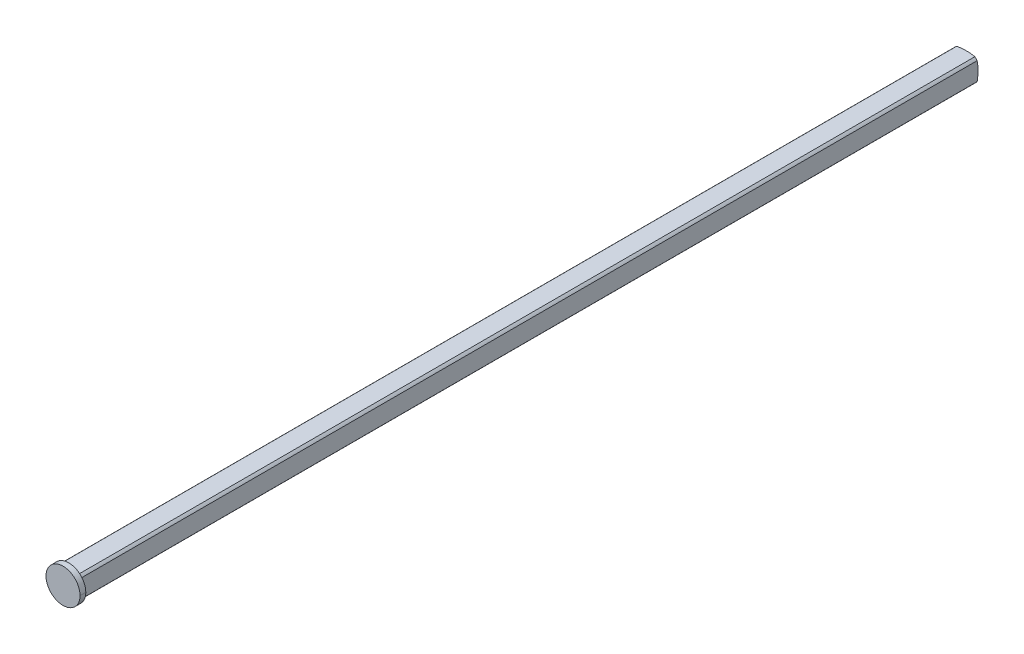
ISO-10303-21;
HEADER;
FILE_DESCRIPTION(('STEP AP214'),'2;1');
FILE_NAME('part.step','',(''),(''),'','','');
FILE_SCHEMA(('AUTOMOTIVE_DESIGN { 1 0 10303 214 1 1 1 1 }'));
ENDSEC;
DATA;
#1=APPLICATION_CONTEXT('core data for automotive mechanical design processes');
#2=APPLICATION_PROTOCOL_DEFINITION('international standard','automotive_design',2000,#1);
#3=PRODUCT_CONTEXT('',#1,'mechanical');
#4=PRODUCT('Part','Part','',(#3));
#5=PRODUCT_RELATED_PRODUCT_CATEGORY('part','',(#4));
#6=PRODUCT_DEFINITION_FORMATION('','',#4);
#7=PRODUCT_DEFINITION_CONTEXT('part definition',#1,'design');
#8=PRODUCT_DEFINITION('design','',#6,#7);
#9=PRODUCT_DEFINITION_SHAPE('','',#8);
#10=(LENGTH_UNIT() NAMED_UNIT(*) SI_UNIT(.MILLI.,.METRE.));
#11=(NAMED_UNIT(*) PLANE_ANGLE_UNIT() SI_UNIT($,.RADIAN.));
#12=(NAMED_UNIT(*) SI_UNIT($,.STERADIAN.) SOLID_ANGLE_UNIT());
#13=UNCERTAINTY_MEASURE_WITH_UNIT(LENGTH_MEASURE(1.E-05),#10,'distance_accuracy_value','');
#14=(GEOMETRIC_REPRESENTATION_CONTEXT(3) GLOBAL_UNCERTAINTY_ASSIGNED_CONTEXT((#13)) GLOBAL_UNIT_ASSIGNED_CONTEXT((#10,
#11,#12)) REPRESENTATION_CONTEXT('',''));
#15=CARTESIAN_POINT('',(0.,0.,0.));
#16=DIRECTION('',(0.,0.,1.));
#17=DIRECTION('',(1.,0.,0.));
#18=AXIS2_PLACEMENT_3D('',#15,#16,#17);
#19=CARTESIAN_POINT('',(0.,0.,0.));
#20=DIRECTION('',(0.,0.,1.));
#21=DIRECTION('',(1.,0.,0.));
#22=AXIS2_PLACEMENT_3D('',#19,#20,#21);
#23=PLANE('',#22);
#24=CARTESIAN_POINT('',(0.,0.,0.));
#25=DIRECTION('',(0.,0.,1.));
#26=DIRECTION('',(1.,0.,0.));
#27=AXIS2_PLACEMENT_3D('',#24,#25,#26);
#28=CIRCLE('',#27,2.375);
#29=CARTESIAN_POINT('',(-2.375,0.,0.));
#30=VERTEX_POINT('',#29);
#31=CARTESIAN_POINT('',(2.375,0.,0.));
#32=VERTEX_POINT('',#31);
#33=EDGE_CURVE('P0_E11',#30,#32,#28,.T.);
#34=ORIENTED_EDGE('',*,*,#33,.F.);
#35=CARTESIAN_POINT('',(0.,0.,0.));
#36=DIRECTION('',(0.,0.,1.));
#37=DIRECTION('',(1.,0.,0.));
#38=AXIS2_PLACEMENT_3D('',#35,#36,#37);
#39=CIRCLE('',#38,2.375);
#40=EDGE_CURVE('P0_E68',#32,#30,#39,.T.);
#41=ORIENTED_EDGE('',*,*,#40,.F.);
#42=EDGE_LOOP('',(#34,#41));
#43=FACE_BOUND('',#42,.T.);
#44=ADVANCED_FACE('P0_F17',(#43),#23,.F.);
#45=CARTESIAN_POINT('',(0.,0.,0.8));
#46=DIRECTION('',(0.,0.,1.));
#47=DIRECTION('',(1.,0.,0.));
#48=AXIS2_PLACEMENT_3D('',#45,#46,#47);
#49=PLANE('',#48);
#50=CARTESIAN_POINT('',(0.,0.,0.8));
#51=DIRECTION('',(0.,0.,1.));
#52=DIRECTION('',(1.,0.,0.));
#53=AXIS2_PLACEMENT_3D('',#50,#51,#52);
#54=CIRCLE('',#53,2.375);
#55=CARTESIAN_POINT('',(-2.375,0.,0.8));
#56=VERTEX_POINT('',#55);
#57=CARTESIAN_POINT('',(2.375,0.,0.8));
#58=VERTEX_POINT('',#57);
#59=EDGE_CURVE('P0_E27',#56,#58,#54,.T.);
#60=ORIENTED_EDGE('',*,*,#59,.T.);
#61=CARTESIAN_POINT('',(0.,0.,0.8));
#62=DIRECTION('',(0.,0.,1.));
#63=DIRECTION('',(1.,0.,0.));
#64=AXIS2_PLACEMENT_3D('',#61,#62,#63);
#65=CIRCLE('',#64,2.375);
#66=EDGE_CURVE('P0_E59',#58,#56,#65,.T.);
#67=ORIENTED_EDGE('',*,*,#66,.T.);
#68=EDGE_LOOP('',(#60,#67));
#69=FACE_BOUND('',#68,.T.);
#70=ADVANCED_FACE('P0_F57',(#69),#49,.T.);
#71=CARTESIAN_POINT('',(0.,0.,0.8));
#72=DIRECTION('',(0.,0.,-1.));
#73=DIRECTION('',(-1.,0.,0.));
#74=AXIS2_PLACEMENT_3D('',#71,#72,#73);
#75=CYLINDRICAL_SURFACE('',#74,2.375);
#76=DIRECTION('',(0.,0.,-1.));
#77=VECTOR('',#76,1.);
#78=CARTESIAN_POINT('',(2.375,0.,0.8));
#79=LINE('',#78,#77);
#80=EDGE_CURVE('P0_E63',#58,#32,#79,.T.);
#81=ORIENTED_EDGE('',*,*,#80,.F.);
#82=ORIENTED_EDGE('',*,*,#59,.F.);
#83=DIRECTION('',(0.,0.,-1.));
#84=VECTOR('',#83,1.);
#85=CARTESIAN_POINT('',(-2.375,0.,0.8));
#86=LINE('',#85,#84);
#87=EDGE_CURVE('P0_E21',#56,#30,#86,.T.);
#88=ORIENTED_EDGE('',*,*,#87,.T.);
#89=ORIENTED_EDGE('',*,*,#33,.T.);
#90=EDGE_LOOP('',(#81,#82,#88,#89));
#91=FACE_BOUND('',#90,.T.);
#92=ADVANCED_FACE('P0_F64',(#91),#75,.T.);
#93=CARTESIAN_POINT('',(0.,0.,0.8));
#94=DIRECTION('',(0.,0.,-1.));
#95=DIRECTION('',(-1.,0.,0.));
#96=AXIS2_PLACEMENT_3D('',#93,#94,#95);
#97=CYLINDRICAL_SURFACE('',#96,2.375);
#98=ORIENTED_EDGE('',*,*,#66,.F.);
#99=ORIENTED_EDGE('',*,*,#80,.T.);
#100=ORIENTED_EDGE('',*,*,#40,.T.);
#101=ORIENTED_EDGE('',*,*,#87,.F.);
#102=EDGE_LOOP('',(#98,#99,#100,#101));
#103=FACE_BOUND('',#102,.T.);
#104=ADVANCED_FACE('P0_F19',(#103),#97,.T.);
#105=CLOSED_SHELL('',(#44,#70,#92,#104));
#106=MANIFOLD_SOLID_BREP('P0_B1',#105);
#107=CARTESIAN_POINT('',(0.,0.,-125.222));
#108=DIRECTION('',(0.,0.,1.));
#109=DIRECTION('',(1.,0.,0.));
#110=AXIS2_PLACEMENT_3D('',#107,#108,#109);
#111=CYLINDRICAL_SURFACE('',#110,2.032);
#112=DIRECTION('',(0.,0.,-1.));
#113=VECTOR('',#112,1.);
#114=CARTESIAN_POINT('',(1.5875,1.26841150657032,-125.222));
#115=LINE('',#114,#113);
#116=CARTESIAN_POINT('',(1.5875,1.26841150657032,0.));
#117=VERTEX_POINT('',#116);
#118=CARTESIAN_POINT('',(1.5875,1.26841150657032,-125.070919142098));
#119=VERTEX_POINT('',#118);
#120=EDGE_CURVE('P1_E464',#117,#119,#115,.T.);
#121=ORIENTED_EDGE('',*,*,#120,.T.);
#122=CARTESIAN_POINT('',(0.,0.,-125.070919142098));
#123=DIRECTION('',(0.,0.,1.));
#124=DIRECTION('',(1.,0.,0.));
#125=AXIS2_PLACEMENT_3D('',#122,#123,#124);
#126=CIRCLE('',#125,2.032);
#127=CARTESIAN_POINT('',(1.26841150657032,1.5875,-125.070919142098));
#128=VERTEX_POINT('',#127);
#129=EDGE_CURVE('P1_E266',#119,#128,#126,.T.);
#130=ORIENTED_EDGE('',*,*,#129,.T.);
#131=DIRECTION('',(0.,0.,1.));
#132=VECTOR('',#131,1.);
#133=CARTESIAN_POINT('',(1.26841150657032,1.5875,-125.222));
#134=LINE('',#133,#132);
#135=CARTESIAN_POINT('',(1.26841150657032,1.5875,0.));
#136=VERTEX_POINT('',#135);
#137=EDGE_CURVE('P1_E238',#128,#136,#134,.T.);
#138=ORIENTED_EDGE('',*,*,#137,.T.);
#139=CARTESIAN_POINT('',(0.,0.,0.));
#140=DIRECTION('',(0.,0.,1.));
#141=DIRECTION('',(1.,0.,0.));
#142=AXIS2_PLACEMENT_3D('',#139,#140,#141);
#143=CIRCLE('',#142,2.032);
#144=EDGE_CURVE('P1_E138',#117,#136,#143,.T.);
#145=ORIENTED_EDGE('',*,*,#144,.F.);
#146=EDGE_LOOP('',(#121,#130,#138,#145));
#147=FACE_BOUND('',#146,.T.);
#148=ADVANCED_FACE('P1_F17',(#147),#111,.T.);
#149=CARTESIAN_POINT('',(0.,0.,-125.222));
#150=DIRECTION('',(0.,0.,1.));
#151=DIRECTION('',(1.,0.,0.));
#152=AXIS2_PLACEMENT_3D('',#149,#150,#151);
#153=CYLINDRICAL_SURFACE('',#152,2.032);
#154=DIRECTION('',(0.,0.,1.));
#155=VECTOR('',#154,1.);
#156=CARTESIAN_POINT('',(-1.5875,1.26841150657032,-125.222));
#157=LINE('',#156,#155);
#158=CARTESIAN_POINT('',(-1.5875,1.26841150657032,-125.070919142098));
#159=VERTEX_POINT('',#158);
#160=CARTESIAN_POINT('',(-1.5875,1.26841150657032,0.));
#161=VERTEX_POINT('',#160);
#162=EDGE_CURVE('P1_E213',#159,#161,#157,.T.);
#163=ORIENTED_EDGE('',*,*,#162,.T.);
#164=CARTESIAN_POINT('',(0.,0.,0.));
#165=DIRECTION('',(0.,0.,1.));
#166=DIRECTION('',(1.,0.,0.));
#167=AXIS2_PLACEMENT_3D('',#164,#165,#166);
#168=CIRCLE('',#167,2.032);
#169=CARTESIAN_POINT('',(-1.26841150657032,1.5875,0.));
#170=VERTEX_POINT('',#169);
#171=EDGE_CURVE('P1_E44',#170,#161,#168,.T.);
#172=ORIENTED_EDGE('',*,*,#171,.F.);
#173=DIRECTION('',(0.,0.,-1.));
#174=VECTOR('',#173,1.);
#175=CARTESIAN_POINT('',(-1.26841150657032,1.5875,-125.222));
#176=LINE('',#175,#174);
#177=CARTESIAN_POINT('',(-1.26841150657032,1.5875,-125.070919142098));
#178=VERTEX_POINT('',#177);
#179=EDGE_CURVE('P1_E246',#170,#178,#176,.T.);
#180=ORIENTED_EDGE('',*,*,#179,.T.);
#181=CARTESIAN_POINT('',(0.,0.,-125.070919142098));
#182=DIRECTION('',(0.,0.,1.));
#183=DIRECTION('',(1.,0.,0.));
#184=AXIS2_PLACEMENT_3D('',#181,#182,#183);
#185=CIRCLE('',#184,2.032);
#186=EDGE_CURVE('P1_E255',#178,#159,#185,.T.);
#187=ORIENTED_EDGE('',*,*,#186,.T.);
#188=EDGE_LOOP('',(#163,#172,#180,#187));
#189=FACE_BOUND('',#188,.T.);
#190=ADVANCED_FACE('P1_F361',(#189),#153,.T.);
#191=CARTESIAN_POINT('',(0.,0.,-125.222));
#192=DIRECTION('',(0.,0.,1.));
#193=DIRECTION('',(1.,0.,0.));
#194=AXIS2_PLACEMENT_3D('',#191,#192,#193);
#195=CYLINDRICAL_SURFACE('',#194,2.032);
#196=DIRECTION('',(0.,0.,-1.));
#197=VECTOR('',#196,1.);
#198=CARTESIAN_POINT('',(-1.5875,-1.26841150657032,-125.222));
#199=LINE('',#198,#197);
#200=CARTESIAN_POINT('',(-1.5875,-1.26841150657032,0.));
#201=VERTEX_POINT('',#200);
#202=CARTESIAN_POINT('',(-1.5875,-1.26841150657032,-125.070919142098));
#203=VERTEX_POINT('',#202);
#204=EDGE_CURVE('P1_E286',#201,#203,#199,.T.);
#205=ORIENTED_EDGE('',*,*,#204,.T.);
#206=CARTESIAN_POINT('',(0.,0.,-125.070919142098));
#207=DIRECTION('',(0.,0.,1.));
#208=DIRECTION('',(1.,0.,0.));
#209=AXIS2_PLACEMENT_3D('',#206,#207,#208);
#210=CIRCLE('',#209,2.032);
#211=CARTESIAN_POINT('',(-1.26841150657032,-1.5875,-125.070919142098));
#212=VERTEX_POINT('',#211);
#213=EDGE_CURVE('P1_E11',#203,#212,#210,.T.);
#214=ORIENTED_EDGE('',*,*,#213,.T.);
#215=DIRECTION('',(0.,0.,1.));
#216=VECTOR('',#215,1.);
#217=CARTESIAN_POINT('',(-1.26841150657032,-1.5875,-125.222));
#218=LINE('',#217,#216);
#219=CARTESIAN_POINT('',(-1.26841150657032,-1.5875,0.));
#220=VERTEX_POINT('',#219);
#221=EDGE_CURVE('P1_E159',#212,#220,#218,.T.);
#222=ORIENTED_EDGE('',*,*,#221,.T.);
#223=CARTESIAN_POINT('',(0.,0.,0.));
#224=DIRECTION('',(0.,0.,1.));
#225=DIRECTION('',(1.,0.,0.));
#226=AXIS2_PLACEMENT_3D('',#223,#224,#225);
#227=CIRCLE('',#226,2.032);
#228=EDGE_CURVE('P1_E139',#201,#220,#227,.T.);
#229=ORIENTED_EDGE('',*,*,#228,.F.);
#230=EDGE_LOOP('',(#205,#214,#222,#229));
#231=FACE_BOUND('',#230,.T.);
#232=ADVANCED_FACE('P1_F223',(#231),#195,.T.);
#233=CARTESIAN_POINT('',(0.,0.,-125.222));
#234=DIRECTION('',(0.,0.,1.));
#235=DIRECTION('',(1.,0.,0.));
#236=AXIS2_PLACEMENT_3D('',#233,#234,#235);
#237=CYLINDRICAL_SURFACE('',#236,2.032);
#238=DIRECTION('',(0.,0.,-1.));
#239=VECTOR('',#238,1.);
#240=CARTESIAN_POINT('',(1.26841150657032,-1.5875,-125.222));
#241=LINE('',#240,#239);
#242=CARTESIAN_POINT('',(1.26841150657032,-1.5875,0.));
#243=VERTEX_POINT('',#242);
#244=CARTESIAN_POINT('',(1.26841150657032,-1.5875,-125.070919142098));
#245=VERTEX_POINT('',#244);
#246=EDGE_CURVE('P1_E131',#243,#245,#241,.T.);
#247=ORIENTED_EDGE('',*,*,#246,.T.);
#248=CARTESIAN_POINT('',(0.,0.,-125.070919142098));
#249=DIRECTION('',(0.,0.,1.));
#250=DIRECTION('',(1.,0.,0.));
#251=AXIS2_PLACEMENT_3D('',#248,#249,#250);
#252=CIRCLE('',#251,2.032);
#253=CARTESIAN_POINT('',(1.5875,-1.26841150657032,-125.070919142098));
#254=VERTEX_POINT('',#253);
#255=EDGE_CURVE('P1_E29',#245,#254,#252,.T.);
#256=ORIENTED_EDGE('',*,*,#255,.T.);
#257=DIRECTION('',(0.,0.,1.));
#258=VECTOR('',#257,1.);
#259=CARTESIAN_POINT('',(1.5875,-1.26841150657032,-125.222));
#260=LINE('',#259,#258);
#261=CARTESIAN_POINT('',(1.5875,-1.26841150657032,0.));
#262=VERTEX_POINT('',#261);
#263=EDGE_CURVE('P1_E134',#254,#262,#260,.T.);
#264=ORIENTED_EDGE('',*,*,#263,.T.);
#265=CARTESIAN_POINT('',(0.,0.,0.));
#266=DIRECTION('',(0.,0.,1.));
#267=DIRECTION('',(1.,0.,0.));
#268=AXIS2_PLACEMENT_3D('',#265,#266,#267);
#269=CIRCLE('',#268,2.032);
#270=EDGE_CURVE('P1_E127',#243,#262,#269,.T.);
#271=ORIENTED_EDGE('',*,*,#270,.F.);
#272=EDGE_LOOP('',(#247,#256,#264,#271));
#273=FACE_BOUND('',#272,.T.);
#274=ADVANCED_FACE('P1_F129',(#273),#237,.T.);
#275=CARTESIAN_POINT('',(-1.5875,1.5875,-125.222));
#276=DIRECTION('',(0.,0.,-1.));
#277=DIRECTION('',(0.,-1.,0.));
#278=AXIS2_PLACEMENT_3D('',#275,#276,#277);
#279=PLANE('',#278);
#280=CARTESIAN_POINT('',(0.,0.,-125.222));
#281=DIRECTION('',(0.,0.,1.));
#282=DIRECTION('',(1.,0.,0.));
#283=AXIS2_PLACEMENT_3D('',#280,#281,#282);
#284=CIRCLE('',#283,1.24506403026729);
#285=CARTESIAN_POINT('',(1.24506403026729,0.,-125.222));
#286=VERTEX_POINT('',#285);
#287=CARTESIAN_POINT('',(-1.24506403026729,0.,-125.222));
#288=VERTEX_POINT('',#287);
#289=EDGE_CURVE('P1_E273',#286,#288,#284,.T.);
#290=ORIENTED_EDGE('',*,*,#289,.F.);
#291=CARTESIAN_POINT('',(0.,0.,-125.222));
#292=DIRECTION('',(0.,0.,1.));
#293=DIRECTION('',(1.,0.,0.));
#294=AXIS2_PLACEMENT_3D('',#291,#292,#293);
#295=CIRCLE('',#294,1.24506403026729);
#296=EDGE_CURVE('P1_E476',#288,#286,#295,.T.);
#297=ORIENTED_EDGE('',*,*,#296,.F.);
#298=EDGE_LOOP('',(#290,#297));
#299=FACE_BOUND('',#298,.T.);
#300=ADVANCED_FACE('P1_F408',(#299),#279,.T.);
#301=CARTESIAN_POINT('',(0.,0.,-123.097));
#302=DIRECTION('',(0.,0.,1.));
#303=DIRECTION('',(1.,0.,0.));
#304=AXIS2_PLACEMENT_3D('',#301,#302,#303);
#305=DEGENERATE_TOROIDAL_SURFACE('',#304,1.24506403026729,2.125,.T.);
#306=CARTESIAN_POINT('',(-1.24506403026729,0.,-123.097));
#307=DIRECTION('',(0.,1.,0.));
#308=DIRECTION('',(-1.,0.,0.));
#309=AXIS2_PLACEMENT_3D('',#306,#307,#308);
#310=CIRCLE('',#309,2.125);
#311=CARTESIAN_POINT('',(-1.5875,0.,-125.194227361693));
#312=VERTEX_POINT('',#311);
#313=EDGE_CURVE('P1_E268',#288,#312,#310,.T.);
#314=ORIENTED_EDGE('',*,*,#313,.F.);
#315=ORIENTED_EDGE('',*,*,#296,.T.);
#316=CARTESIAN_POINT('',(1.24506403026729,0.,-123.097));
#317=DIRECTION('',(0.,-1.,0.));
#318=DIRECTION('',(0.,0.,-1.));
#319=AXIS2_PLACEMENT_3D('',#316,#317,#318);
#320=CIRCLE('',#319,2.125);
#321=CARTESIAN_POINT('',(1.5875,0.,-125.194227361693));
#322=VERTEX_POINT('',#321);
#323=EDGE_CURVE('P1_E308',#286,#322,#320,.T.);
#324=ORIENTED_EDGE('',*,*,#323,.T.);
#325=CARTESIAN_POINT('',(1.5875,-1.26841150657032,-125.070919142098));
#326=CARTESIAN_POINT('',(1.5875,-0.987077094901041,-125.140930639138));
#327=CARTESIAN_POINT('',(1.5875,-0.639530459017566,-125.17018195389));
#328=CARTESIAN_POINT('',(1.5875,-0.353837297484592,-125.194227361693));
#329=CARTESIAN_POINT('',(1.5875,0.,-125.194227361693));
#330=B_SPLINE_CURVE_WITH_KNOTS('',2,(#325,#326,#327,#328,#329),.UNSPECIFIED.,.F.,.F.,(3,2,3),
(0.,0.5,1.),.UNSPECIFIED.);
#331=EDGE_CURVE('P1_E470',#254,#322,#330,.T.);
#332=ORIENTED_EDGE('',*,*,#331,.F.);
#333=ORIENTED_EDGE('',*,*,#255,.F.);
#334=CARTESIAN_POINT('',(-1.26841150657032,-1.5875,-125.070919142098));
#335=CARTESIAN_POINT('',(-0.770338232285675,-1.5875,-125.194867205761));
#336=CARTESIAN_POINT('',(0.00849337593367507,-1.5875,-125.19422365179));
#337=CARTESIAN_POINT('',(0.77547099032373,-1.5875,-125.193589892857));
#338=CARTESIAN_POINT('',(1.26841150657033,-1.5875,-125.070919142098));
#339=B_SPLINE_CURVE_WITH_KNOTS('',2,(#334,#335,#336,#337,#338),.UNSPECIFIED.,.F.,.F.,(3,2,3),
(0.,0.5,1.),.UNSPECIFIED.);
#340=EDGE_CURVE('P1_E150',#212,#245,#339,.T.);
#341=ORIENTED_EDGE('',*,*,#340,.F.);
#342=ORIENTED_EDGE('',*,*,#213,.F.);
#343=CARTESIAN_POINT('',(-1.5875,0.,-125.194227361693));
#344=CARTESIAN_POINT('',(-1.5875,-0.353179957326968,-125.194227361693));
#345=CARTESIAN_POINT('',(-1.5875,-0.639529322286498,-125.170182049451));
#346=CARTESIAN_POINT('',(-1.5875,-0.986669843198274,-125.141031985792));
#347=CARTESIAN_POINT('',(-1.5875,-1.26841150657032,-125.070919142098));
#348=B_SPLINE_CURVE_WITH_KNOTS('',2,(#343,#344,#345,#346,#347),.UNSPECIFIED.,.F.,.F.,(3,2,3),
(0.,0.5,1.),.UNSPECIFIED.);
#349=EDGE_CURVE('P1_E171',#312,#203,#348,.T.);
#350=ORIENTED_EDGE('',*,*,#349,.F.);
#351=EDGE_LOOP('',(#314,#315,#324,#332,#333,#341,#342,#350));
#352=FACE_BOUND('',#351,.T.);
#353=ADVANCED_FACE('P1_F382',(#352),#305,.T.);
#354=CARTESIAN_POINT('',(-1.5875,1.5875,0.));
#355=DIRECTION('',(0.,0.,-1.));
#356=DIRECTION('',(0.,-1.,0.));
#357=AXIS2_PLACEMENT_3D('',#354,#355,#356);
#358=PLANE('',#357);
#359=ORIENTED_EDGE('',*,*,#171,.T.);
#360=DIRECTION('',(0.,-1.,0.));
#361=VECTOR('',#360,1.);
#362=CARTESIAN_POINT('',(-1.5875,-1.5875,0.));
#363=LINE('',#362,#361);
#364=EDGE_CURVE('P1_E289',#161,#201,#363,.T.);
#365=ORIENTED_EDGE('',*,*,#364,.T.);
#366=ORIENTED_EDGE('',*,*,#228,.T.);
#367=DIRECTION('',(1.,0.,0.));
#368=VECTOR('',#367,1.);
#369=CARTESIAN_POINT('',(-1.5875,-1.5875,0.));
#370=LINE('',#369,#368);
#371=EDGE_CURVE('P1_E142',#220,#243,#370,.T.);
#372=ORIENTED_EDGE('',*,*,#371,.T.);
#373=ORIENTED_EDGE('',*,*,#270,.T.);
#374=DIRECTION('',(0.,1.,0.));
#375=VECTOR('',#374,1.);
#376=CARTESIAN_POINT('',(1.5875,-1.5875,0.));
#377=LINE('',#376,#375);
#378=EDGE_CURVE('P1_E247',#262,#117,#377,.T.);
#379=ORIENTED_EDGE('',*,*,#378,.T.);
#380=ORIENTED_EDGE('',*,*,#144,.T.);
#381=DIRECTION('',(-1.,0.,0.));
#382=VECTOR('',#381,1.);
#383=CARTESIAN_POINT('',(-1.5875,1.5875,0.));
#384=LINE('',#383,#382);
#385=EDGE_CURVE('P1_E252',#136,#170,#384,.T.);
#386=ORIENTED_EDGE('',*,*,#385,.T.);
#387=EDGE_LOOP('',(#359,#365,#366,#372,#373,#379,#380,#386));
#388=FACE_BOUND('',#387,.T.);
#389=ADVANCED_FACE('P1_F143',(#388),#358,.F.);
#390=CARTESIAN_POINT('',(-1.5875,1.5875,0.));
#391=DIRECTION('',(0.,-1.,0.));
#392=DIRECTION('',(0.,0.,-1.));
#393=AXIS2_PLACEMENT_3D('',#390,#391,#392);
#394=PLANE('',#393);
#395=ORIENTED_EDGE('',*,*,#137,.F.);
#396=CARTESIAN_POINT('',(1.26841150657033,1.5875,-125.070919142098));
#397=CARTESIAN_POINT('',(0.770338232285675,1.5875,-125.194867205761));
#398=CARTESIAN_POINT('',(-0.00849337593367486,1.5875,-125.19422365179));
#399=CARTESIAN_POINT('',(-0.775470990323726,1.5875,-125.193589892857));
#400=CARTESIAN_POINT('',(-1.26841150657032,1.5875,-125.070919142098));
#401=B_SPLINE_CURVE_WITH_KNOTS('',2,(#396,#397,#398,#399,#400),.UNSPECIFIED.,.F.,.F.,(3,2,3),
(0.,0.5,1.),.UNSPECIFIED.);
#402=EDGE_CURVE('P1_E258',#128,#178,#401,.T.);
#403=ORIENTED_EDGE('',*,*,#402,.T.);
#404=ORIENTED_EDGE('',*,*,#179,.F.);
#405=ORIENTED_EDGE('',*,*,#385,.F.);
#406=EDGE_LOOP('',(#395,#403,#404,#405));
#407=FACE_BOUND('',#406,.T.);
#408=ADVANCED_FACE('P1_F19',(#407),#394,.F.);
#409=CARTESIAN_POINT('',(1.5875,-1.5875,0.));
#410=DIRECTION('',(-1.,0.,0.));
#411=DIRECTION('',(0.,0.,1.));
#412=AXIS2_PLACEMENT_3D('',#409,#410,#411);
#413=PLANE('',#412);
#414=ORIENTED_EDGE('',*,*,#263,.F.);
#415=ORIENTED_EDGE('',*,*,#331,.T.);
#416=CARTESIAN_POINT('',(1.5875,0.,-125.194227361693));
#417=CARTESIAN_POINT('',(1.5875,0.35317995732708,-125.194227361693));
#418=CARTESIAN_POINT('',(1.5875,0.6395293222865,-125.170182049451));
#419=CARTESIAN_POINT('',(1.5875,0.986669843198345,-125.141031985792));
#420=CARTESIAN_POINT('',(1.5875,1.26841150657033,-125.070919142098));
#421=B_SPLINE_CURVE_WITH_KNOTS('',2,(#416,#417,#418,#419,#420),.UNSPECIFIED.,.F.,.F.,(3,2,3),
(0.,0.5,1.),.UNSPECIFIED.);
#422=EDGE_CURVE('P1_E297',#322,#119,#421,.T.);
#423=ORIENTED_EDGE('',*,*,#422,.T.);
#424=ORIENTED_EDGE('',*,*,#120,.F.);
#425=ORIENTED_EDGE('',*,*,#378,.F.);
#426=EDGE_LOOP('',(#414,#415,#423,#424,#425));
#427=FACE_BOUND('',#426,.T.);
#428=ADVANCED_FACE('P1_F189',(#427),#413,.F.);
#429=CARTESIAN_POINT('',(-1.5875,-1.5875,0.));
#430=DIRECTION('',(0.,1.,0.));
#431=DIRECTION('',(1.,0.,0.));
#432=AXIS2_PLACEMENT_3D('',#429,#430,#431);
#433=PLANE('',#432);
#434=ORIENTED_EDGE('',*,*,#221,.F.);
#435=ORIENTED_EDGE('',*,*,#340,.T.);
#436=ORIENTED_EDGE('',*,*,#246,.F.);
#437=ORIENTED_EDGE('',*,*,#371,.F.);
#438=EDGE_LOOP('',(#434,#435,#436,#437));
#439=FACE_BOUND('',#438,.T.);
#440=ADVANCED_FACE('P1_F149',(#439),#433,.F.);
#441=CARTESIAN_POINT('',(-1.5875,-1.5875,0.));
#442=DIRECTION('',(1.,0.,0.));
#443=DIRECTION('',(0.,1.,0.));
#444=AXIS2_PLACEMENT_3D('',#441,#442,#443);
#445=PLANE('',#444);
#446=ORIENTED_EDGE('',*,*,#162,.F.);
#447=CARTESIAN_POINT('',(-1.5875,1.26841150657033,-125.070919142098));
#448=CARTESIAN_POINT('',(-1.5875,0.98707709490106,-125.140930639138));
#449=CARTESIAN_POINT('',(-1.5875,0.639530459017565,-125.17018195389));
#450=CARTESIAN_POINT('',(-1.5875,0.35383729748462,-125.194227361693));
#451=CARTESIAN_POINT('',(-1.5875,0.,-125.194227361693));
#452=B_SPLINE_CURVE_WITH_KNOTS('',2,(#447,#448,#449,#450,#451),.UNSPECIFIED.,.F.,.F.,(3,2,3),
(0.,0.5,1.),.UNSPECIFIED.);
#453=EDGE_CURVE('P1_E209',#159,#312,#452,.T.);
#454=ORIENTED_EDGE('',*,*,#453,.T.);
#455=ORIENTED_EDGE('',*,*,#349,.T.);
#456=ORIENTED_EDGE('',*,*,#204,.F.);
#457=ORIENTED_EDGE('',*,*,#364,.F.);
#458=EDGE_LOOP('',(#446,#454,#455,#456,#457));
#459=FACE_BOUND('',#458,.T.);
#460=ADVANCED_FACE('P1_F177',(#459),#445,.F.);
#461=CARTESIAN_POINT('',(0.,0.,-123.097));
#462=DIRECTION('',(0.,0.,1.));
#463=DIRECTION('',(1.,0.,0.));
#464=AXIS2_PLACEMENT_3D('',#461,#462,#463);
#465=DEGENERATE_TOROIDAL_SURFACE('',#464,1.24506403026729,2.125,.T.);
#466=ORIENTED_EDGE('',*,*,#289,.T.);
#467=ORIENTED_EDGE('',*,*,#313,.T.);
#468=ORIENTED_EDGE('',*,*,#453,.F.);
#469=ORIENTED_EDGE('',*,*,#186,.F.);
#470=ORIENTED_EDGE('',*,*,#402,.F.);
#471=ORIENTED_EDGE('',*,*,#129,.F.);
#472=ORIENTED_EDGE('',*,*,#422,.F.);
#473=ORIENTED_EDGE('',*,*,#323,.F.);
#474=EDGE_LOOP('',(#466,#467,#468,#469,#470,#471,#472,#473));
#475=FACE_BOUND('',#474,.T.);
#476=ADVANCED_FACE('P1_F187',(#475),#465,.T.);
#477=CLOSED_SHELL('',(#148,#190,#232,#274,#300,#353,#389,#408,#428,#440,#460,#476));
#478=MANIFOLD_SOLID_BREP('P1_B1',#477);
#479=ADVANCED_BREP_SHAPE_REPRESENTATION('',(#18,#106,#478),#14);
#480=SHAPE_DEFINITION_REPRESENTATION(#9,#479);
ENDSEC;
END-ISO-10303-21;
